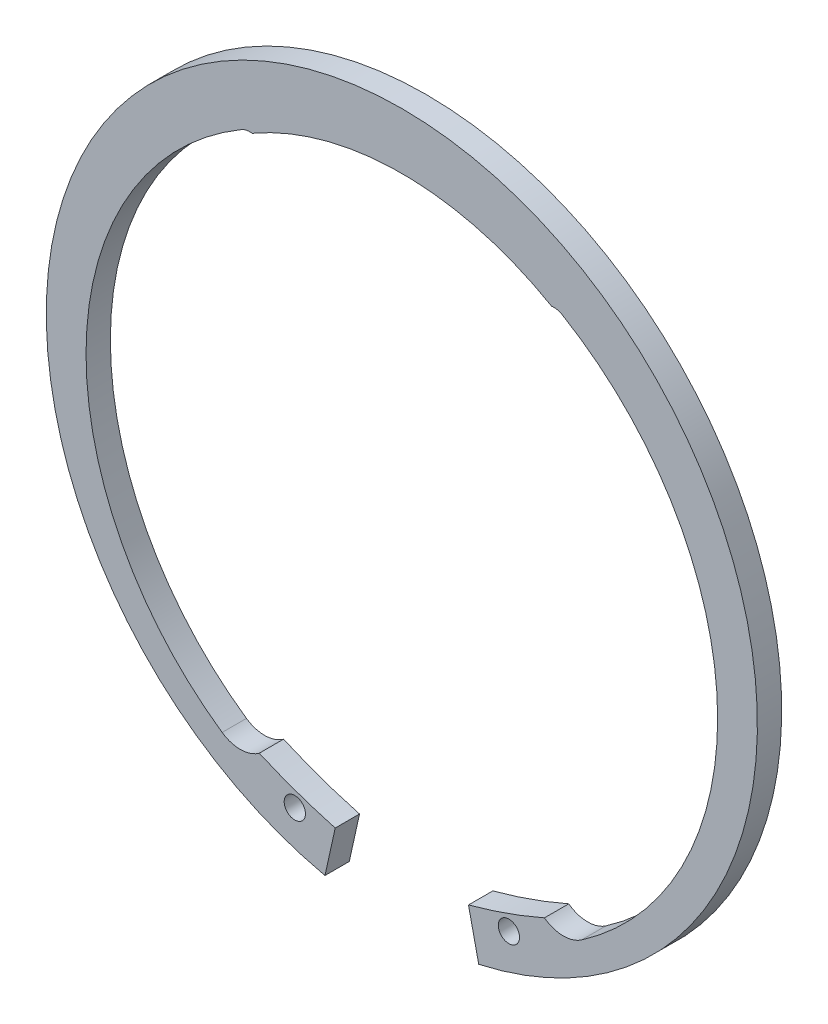
ISO-10303-21;
HEADER;
FILE_DESCRIPTION(('STEP AP214'),'2;1');
FILE_NAME('part.step','',(''),(''),'','','');
FILE_SCHEMA(('AUTOMOTIVE_DESIGN { 1 0 10303 214 1 1 1 1 }'));
ENDSEC;
DATA;
#1=APPLICATION_CONTEXT('core data for automotive mechanical design processes');
#2=APPLICATION_PROTOCOL_DEFINITION('international standard','automotive_design',2000,#1);
#3=PRODUCT_CONTEXT('',#1,'mechanical');
#4=PRODUCT('Part','Part','',(#3));
#5=PRODUCT_RELATED_PRODUCT_CATEGORY('part','',(#4));
#6=PRODUCT_DEFINITION_FORMATION('','',#4);
#7=PRODUCT_DEFINITION_CONTEXT('part definition',#1,'design');
#8=PRODUCT_DEFINITION('design','',#6,#7);
#9=PRODUCT_DEFINITION_SHAPE('','',#8);
#10=(LENGTH_UNIT() NAMED_UNIT(*) SI_UNIT(.MILLI.,.METRE.));
#11=(NAMED_UNIT(*) PLANE_ANGLE_UNIT() SI_UNIT($,.RADIAN.));
#12=(NAMED_UNIT(*) SI_UNIT($,.STERADIAN.) SOLID_ANGLE_UNIT());
#13=UNCERTAINTY_MEASURE_WITH_UNIT(LENGTH_MEASURE(1.E-05),#10,'distance_accuracy_value','');
#14=(GEOMETRIC_REPRESENTATION_CONTEXT(3) GLOBAL_UNCERTAINTY_ASSIGNED_CONTEXT((#13)) GLOBAL_UNIT_ASSIGNED_CONTEXT((#10,
#11,#12)) REPRESENTATION_CONTEXT('',''));
#15=CARTESIAN_POINT('',(0.,0.,0.));
#16=DIRECTION('',(0.,0.,1.));
#17=DIRECTION('',(1.,0.,0.));
#18=AXIS2_PLACEMENT_3D('',#15,#16,#17);
#19=CARTESIAN_POINT('',(0.,0.,-2.));
#20=DIRECTION('',(0.,0.,-1.));
#21=DIRECTION('',(-1.,0.,0.));
#22=AXIS2_PLACEMENT_3D('',#19,#20,#21);
#23=PLANE('',#22);
#24=CARTESIAN_POINT('',(17.6115210050812,-49.9392111625646,-2.));
#25=DIRECTION('',(0.,0.,1.));
#26=DIRECTION('',(-1.,0.,0.));
#27=AXIS2_PLACEMENT_3D('',#24,#25,#26);
#28=CIRCLE('',#27,1.75);
#29=CARTESIAN_POINT('',(15.8615210050812,-49.9392111625646,-2.));
#30=VERTEX_POINT('',#29);
#31=EDGE_CURVE('E169',#30,#30,#28,.T.);
#32=ORIENTED_EDGE('',*,*,#31,.T.);
#33=EDGE_LOOP('',(#32));
#34=FACE_BOUND('',#33,.T.);
#35=CARTESIAN_POINT('',(-17.6115210050812,-49.9392111625646,-2.));
#36=DIRECTION('',(0.,0.,1.));
#37=DIRECTION('',(1.,0.,0.));
#38=AXIS2_PLACEMENT_3D('',#35,#36,#37);
#39=CIRCLE('',#38,1.75);
#40=CARTESIAN_POINT('',(-15.8615210050812,-49.9392111625646,-2.));
#41=VERTEX_POINT('',#40);
#42=EDGE_CURVE('E178',#41,#41,#39,.T.);
#43=ORIENTED_EDGE('',*,*,#42,.T.);
#44=EDGE_LOOP('',(#43));
#45=FACE_BOUND('',#44,.T.);
#46=DIRECTION('',(0.216216216216215,-0.976345506388565,0.));
#47=VECTOR('',#46,1.);
#48=CARTESIAN_POINT('',(12.6486486486487,-57.116212123731,-2.));
#49=LINE('',#48,#47);
#50=CARTESIAN_POINT('',(10.9621621621622,-49.5007171739002,-2.));
#51=VERTEX_POINT('',#50);
#52=CARTESIAN_POINT('',(12.6486486486487,-57.116212123731,-2.));
#53=VERTEX_POINT('',#52);
#54=EDGE_CURVE('E200',#51,#53,#49,.T.);
#55=ORIENTED_EDGE('',*,*,#54,.F.);
#56=CARTESIAN_POINT('',(-11.9615727865522,35.4286964420608,-2.));
#57=DIRECTION('',(0.,0.,-1.));
#58=DIRECTION('',(-1.,0.,0.));
#59=AXIS2_PLACEMENT_3D('',#56,#57,#58);
#60=CIRCLE('',#59,87.9687610527163);
#61=CARTESIAN_POINT('',(23.4623380808683,-45.0924154479705,-2.));
#62=VERTEX_POINT('',#61);
#63=EDGE_CURVE('E145',#62,#51,#60,.T.);
#64=ORIENTED_EDGE('',*,*,#63,.F.);
#65=CARTESIAN_POINT('',(26.5803005052665,-40.8685771082561,-2.));
#66=DIRECTION('',(0.,0.,-1.));
#67=DIRECTION('',(-1.,0.,0.));
#68=AXIS2_PLACEMENT_3D('',#65,#66,#67);
#69=CIRCLE('',#68,5.25);
#70=CARTESIAN_POINT('',(29.5678451103289,-45.1856452375265,-2.));
#71=VERTEX_POINT('',#70);
#72=EDGE_CURVE('E154',#71,#62,#69,.T.);
#73=ORIENTED_EDGE('',*,*,#72,.F.);
#74=CARTESIAN_POINT('',(0.,-2.45945411699753,-2.));
#75=DIRECTION('',(0.,0.,-1.));
#76=DIRECTION('',(-1.,0.,0.));
#77=AXIS2_PLACEMENT_3D('',#74,#75,#76);
#78=CIRCLE('',#77,51.9594541169975);
#79=CARTESIAN_POINT('',(26.420381097304,42.2814481404402,-2.));
#80=VERTEX_POINT('',#79);
#81=EDGE_CURVE('E193',#80,#71,#78,.T.);
#82=ORIENTED_EDGE('',*,*,#81,.F.);
#83=CARTESIAN_POINT('',(24.9821742273401,39.845954391957,-2.));
#84=DIRECTION('',(0.,0.,-1.));
#85=DIRECTION('',(-1.,0.,0.));
#86=AXIS2_PLACEMENT_3D('',#83,#84,#85);
#87=CIRCLE('',#86,2.82843928690575);
#88=CARTESIAN_POINT('',(24.6249999999997,42.6517511363838,-2.));
#89=VERTEX_POINT('',#88);
#90=EDGE_CURVE('E267',#89,#80,#87,.T.);
#91=ORIENTED_EDGE('',*,*,#90,.F.);
#92=CARTESIAN_POINT('',(0.,0.,-2.));
#93=DIRECTION('',(0.,0.,-1.));
#94=DIRECTION('',(-1.,0.,0.));
#95=AXIS2_PLACEMENT_3D('',#92,#93,#94);
#96=CIRCLE('',#95,49.25);
#97=CARTESIAN_POINT('',(-24.6249999999998,42.6517511363838,-2.));
#98=VERTEX_POINT('',#97);
#99=EDGE_CURVE('E296',#98,#89,#96,.T.);
#100=ORIENTED_EDGE('',*,*,#99,.F.);
#101=CARTESIAN_POINT('',(-24.9821742273401,39.845954391957,-2.));
#102=DIRECTION('',(0.,0.,-1.));
#103=DIRECTION('',(-1.,0.,0.));
#104=AXIS2_PLACEMENT_3D('',#101,#102,#103);
#105=CIRCLE('',#104,2.82843928690575);
#106=CARTESIAN_POINT('',(-26.420381097304,42.2814481404402,-2.));
#107=VERTEX_POINT('',#106);
#108=EDGE_CURVE('E260',#107,#98,#105,.T.);
#109=ORIENTED_EDGE('',*,*,#108,.F.);
#110=CARTESIAN_POINT('',(-29.5678451103289,-45.1856452375265,-2.));
#111=VERTEX_POINT('',#110);
#112=EDGE_CURVE('E194',#111,#107,#78,.T.);
#113=ORIENTED_EDGE('',*,*,#112,.F.);
#114=CARTESIAN_POINT('',(-26.5803005052665,-40.8685771082561,-2.));
#115=DIRECTION('',(0.,0.,-1.));
#116=DIRECTION('',(1.,0.,0.));
#117=AXIS2_PLACEMENT_3D('',#114,#115,#116);
#118=CIRCLE('',#117,5.25);
#119=CARTESIAN_POINT('',(-23.4623380808683,-45.0924154479705,-2.));
#120=VERTEX_POINT('',#119);
#121=EDGE_CURVE('E189',#120,#111,#118,.T.);
#122=ORIENTED_EDGE('',*,*,#121,.F.);
#123=CARTESIAN_POINT('',(11.9615727865522,35.4286964420608,-2.));
#124=DIRECTION('',(0.,0.,1.));
#125=DIRECTION('',(1.,0.,0.));
#126=AXIS2_PLACEMENT_3D('',#123,#124,#125);
#127=CIRCLE('',#126,87.9687610527163);
#128=CARTESIAN_POINT('',(-10.9621621621622,-49.5007171739002,-2.));
#129=VERTEX_POINT('',#128);
#130=EDGE_CURVE('E301',#120,#129,#127,.T.);
#131=ORIENTED_EDGE('',*,*,#130,.T.);
#132=DIRECTION('',(0.216216216216215,0.976345506388565,0.));
#133=VECTOR('',#132,1.);
#134=CARTESIAN_POINT('',(-12.6486486486486,-57.116212123731,-2.));
#135=LINE('',#134,#133);
#136=CARTESIAN_POINT('',(-12.6486486486486,-57.116212123731,-2.));
#137=VERTEX_POINT('',#136);
#138=EDGE_CURVE('E185',#137,#129,#135,.T.);
#139=ORIENTED_EDGE('',*,*,#138,.F.);
#140=CARTESIAN_POINT('',(0.,0.,-2.));
#141=DIRECTION('',(0.,0.,1.));
#142=DIRECTION('',(-1.,0.,0.));
#143=AXIS2_PLACEMENT_3D('',#140,#141,#142);
#144=CIRCLE('',#143,58.5);
#145=EDGE_CURVE('E182',#53,#137,#144,.T.);
#146=ORIENTED_EDGE('',*,*,#145,.F.);
#147=EDGE_LOOP('',(#55,#64,#73,#82,#91,#100,#109,#113,#122,#131,#139,#146));
#148=FACE_BOUND('',#147,.T.);
#149=ADVANCED_FACE('F43',(#34,#45,#148),#23,.T.);
#150=CARTESIAN_POINT('',(0.,0.,2.));
#151=DIRECTION('',(0.,0.,-1.));
#152=DIRECTION('',(-1.,0.,0.));
#153=AXIS2_PLACEMENT_3D('',#150,#151,#152);
#154=PLANE('',#153);
#155=CARTESIAN_POINT('',(17.6115210050812,-49.9392111625646,2.));
#156=DIRECTION('',(0.,0.,1.));
#157=DIRECTION('',(-1.,0.,0.));
#158=AXIS2_PLACEMENT_3D('',#155,#156,#157);
#159=CIRCLE('',#158,1.75);
#160=CARTESIAN_POINT('',(15.8615210050812,-49.9392111625646,2.));
#161=VERTEX_POINT('',#160);
#162=EDGE_CURVE('E237',#161,#161,#159,.T.);
#163=ORIENTED_EDGE('',*,*,#162,.F.);
#164=EDGE_LOOP('',(#163));
#165=FACE_BOUND('',#164,.T.);
#166=CARTESIAN_POINT('',(-17.6115210050812,-49.9392111625646,2.));
#167=DIRECTION('',(0.,0.,1.));
#168=DIRECTION('',(1.,0.,0.));
#169=AXIS2_PLACEMENT_3D('',#166,#167,#168);
#170=CIRCLE('',#169,1.75);
#171=CARTESIAN_POINT('',(-15.8615210050812,-49.9392111625646,2.));
#172=VERTEX_POINT('',#171);
#173=EDGE_CURVE('E232',#172,#172,#170,.T.);
#174=ORIENTED_EDGE('',*,*,#173,.F.);
#175=EDGE_LOOP('',(#174));
#176=FACE_BOUND('',#175,.T.);
#177=CARTESIAN_POINT('',(-11.9615727865522,35.4286964420608,2.));
#178=DIRECTION('',(0.,0.,-1.));
#179=DIRECTION('',(-1.,0.,0.));
#180=AXIS2_PLACEMENT_3D('',#177,#178,#179);
#181=CIRCLE('',#180,87.9687610527163);
#182=CARTESIAN_POINT('',(23.4623380808683,-45.0924154479705,2.));
#183=VERTEX_POINT('',#182);
#184=CARTESIAN_POINT('',(10.9621621621622,-49.5007171739002,2.));
#185=VERTEX_POINT('',#184);
#186=EDGE_CURVE('E134',#183,#185,#181,.T.);
#187=ORIENTED_EDGE('',*,*,#186,.T.);
#188=DIRECTION('',(0.216216216216215,-0.976345506388565,0.));
#189=VECTOR('',#188,1.);
#190=CARTESIAN_POINT('',(12.6486486486487,-57.116212123731,2.));
#191=LINE('',#190,#189);
#192=CARTESIAN_POINT('',(12.6486486486487,-57.116212123731,2.));
#193=VERTEX_POINT('',#192);
#194=EDGE_CURVE('E163',#185,#193,#191,.T.);
#195=ORIENTED_EDGE('',*,*,#194,.T.);
#196=CARTESIAN_POINT('',(0.,0.,2.));
#197=DIRECTION('',(0.,0.,1.));
#198=DIRECTION('',(-1.,0.,0.));
#199=AXIS2_PLACEMENT_3D('',#196,#197,#198);
#200=CIRCLE('',#199,58.5);
#201=CARTESIAN_POINT('',(-12.6486486486486,-57.116212123731,2.));
#202=VERTEX_POINT('',#201);
#203=EDGE_CURVE('E223',#193,#202,#200,.T.);
#204=ORIENTED_EDGE('',*,*,#203,.T.);
#205=DIRECTION('',(0.216216216216215,0.976345506388565,0.));
#206=VECTOR('',#205,1.);
#207=CARTESIAN_POINT('',(-12.6486486486486,-57.116212123731,2.));
#208=LINE('',#207,#206);
#209=CARTESIAN_POINT('',(-10.9621621621622,-49.5007171739002,2.));
#210=VERTEX_POINT('',#209);
#211=EDGE_CURVE('E225',#202,#210,#208,.T.);
#212=ORIENTED_EDGE('',*,*,#211,.T.);
#213=CARTESIAN_POINT('',(11.9615727865522,35.4286964420608,2.));
#214=DIRECTION('',(0.,0.,1.));
#215=DIRECTION('',(1.,0.,0.));
#216=AXIS2_PLACEMENT_3D('',#213,#214,#215);
#217=CIRCLE('',#216,87.9687610527163);
#218=CARTESIAN_POINT('',(-23.4623380808683,-45.0924154479705,2.));
#219=VERTEX_POINT('',#218);
#220=EDGE_CURVE('E248',#219,#210,#217,.T.);
#221=ORIENTED_EDGE('',*,*,#220,.F.);
#222=CARTESIAN_POINT('',(-26.5803005052665,-40.8685771082561,2.));
#223=DIRECTION('',(0.,0.,-1.));
#224=DIRECTION('',(1.,0.,0.));
#225=AXIS2_PLACEMENT_3D('',#222,#223,#224);
#226=CIRCLE('',#225,5.25);
#227=CARTESIAN_POINT('',(-29.5678451103289,-45.1856452375265,2.));
#228=VERTEX_POINT('',#227);
#229=EDGE_CURVE('E229',#219,#228,#226,.T.);
#230=ORIENTED_EDGE('',*,*,#229,.T.);
#231=CARTESIAN_POINT('',(0.,-2.45945411699753,2.));
#232=DIRECTION('',(0.,0.,-1.));
#233=DIRECTION('',(-1.,0.,0.));
#234=AXIS2_PLACEMENT_3D('',#231,#232,#233);
#235=CIRCLE('',#234,51.9594541169975);
#236=CARTESIAN_POINT('',(-26.420381097304,42.2814481404402,1.99999999999999));
#237=VERTEX_POINT('',#236);
#238=EDGE_CURVE('E164',#228,#237,#235,.T.);
#239=ORIENTED_EDGE('',*,*,#238,.T.);
#240=CARTESIAN_POINT('',(-24.9821742273401,39.845954391957,1.99999999999999));
#241=DIRECTION('',(0.,0.,-1.));
#242=DIRECTION('',(-1.,0.,0.));
#243=AXIS2_PLACEMENT_3D('',#240,#241,#242);
#244=CIRCLE('',#243,2.82843928690575);
#245=CARTESIAN_POINT('',(-24.6249999999998,42.6517511363838,1.99999999999999));
#246=VERTEX_POINT('',#245);
#247=EDGE_CURVE('E270',#246,#237,#244,.F.);
#248=ORIENTED_EDGE('',*,*,#247,.F.);
#249=CARTESIAN_POINT('',(0.,0.,1.99999999999999));
#250=DIRECTION('',(0.,0.,-1.));
#251=DIRECTION('',(-1.,0.,0.));
#252=AXIS2_PLACEMENT_3D('',#249,#250,#251);
#253=CIRCLE('',#252,49.25);
#254=CARTESIAN_POINT('',(24.6249999999997,42.6517511363838,1.99999999999999));
#255=VERTEX_POINT('',#254);
#256=EDGE_CURVE('E284',#255,#246,#253,.F.);
#257=ORIENTED_EDGE('',*,*,#256,.F.);
#258=CARTESIAN_POINT('',(24.9821742273401,39.845954391957,1.99999999999999));
#259=DIRECTION('',(0.,0.,-1.));
#260=DIRECTION('',(-1.,0.,0.));
#261=AXIS2_PLACEMENT_3D('',#258,#259,#260);
#262=CIRCLE('',#261,2.82843928690575);
#263=CARTESIAN_POINT('',(26.4203810973039,42.2814481404402,1.99999999999999));
#264=VERTEX_POINT('',#263);
#265=EDGE_CURVE('E277',#264,#255,#262,.F.);
#266=ORIENTED_EDGE('',*,*,#265,.F.);
#267=CARTESIAN_POINT('',(29.5678451103289,-45.1856452375265,2.));
#268=VERTEX_POINT('',#267);
#269=EDGE_CURVE('E160',#264,#268,#235,.T.);
#270=ORIENTED_EDGE('',*,*,#269,.T.);
#271=CARTESIAN_POINT('',(26.5803005052665,-40.8685771082561,2.));
#272=DIRECTION('',(0.,0.,-1.));
#273=DIRECTION('',(-1.,0.,0.));
#274=AXIS2_PLACEMENT_3D('',#271,#272,#273);
#275=CIRCLE('',#274,5.25);
#276=EDGE_CURVE('E152',#268,#183,#275,.T.);
#277=ORIENTED_EDGE('',*,*,#276,.T.);
#278=EDGE_LOOP('',(#187,#195,#204,#212,#221,#230,#239,#248,#257,#266,#270,#277));
#279=FACE_BOUND('',#278,.T.);
#280=ADVANCED_FACE('F158',(#165,#176,#279),#154,.F.);
#281=CARTESIAN_POINT('',(0.,-2.45945411699753,-2.));
#282=DIRECTION('',(0.,0.,1.));
#283=DIRECTION('',(1.,0.,0.));
#284=AXIS2_PLACEMENT_3D('',#281,#282,#283);
#285=CYLINDRICAL_SURFACE('',#284,51.9594541169975);
#286=ORIENTED_EDGE('',*,*,#269,.F.);
#287=DIRECTION('',(0.,0.,-1.));
#288=VECTOR('',#287,1.);
#289=CARTESIAN_POINT('',(26.420381097304,42.2814481404402,55.3315445140703));
#290=LINE('',#289,#288);
#291=EDGE_CURVE('E61',#264,#80,#290,.T.);
#292=ORIENTED_EDGE('',*,*,#291,.T.);
#293=ORIENTED_EDGE('',*,*,#81,.T.);
#294=DIRECTION('',(0.,0.,1.));
#295=VECTOR('',#294,1.);
#296=CARTESIAN_POINT('',(29.5678451103289,-45.1856452375265,-2.));
#297=LINE('',#296,#295);
#298=EDGE_CURVE('E156',#71,#268,#297,.T.);
#299=ORIENTED_EDGE('',*,*,#298,.T.);
#300=EDGE_LOOP('',(#286,#292,#293,#299));
#301=FACE_BOUND('',#300,.T.);
#302=ADVANCED_FACE('F325',(#301),#285,.F.);
#303=CARTESIAN_POINT('',(0.,0.,-2.));
#304=DIRECTION('',(0.,0.,1.));
#305=DIRECTION('',(1.,0.,0.));
#306=AXIS2_PLACEMENT_3D('',#303,#304,#305);
#307=CYLINDRICAL_SURFACE('',#306,58.5);
#308=DIRECTION('',(0.,0.,1.));
#309=VECTOR('',#308,1.);
#310=CARTESIAN_POINT('',(-12.6486486486486,-57.116212123731,-2.));
#311=LINE('',#310,#309);
#312=EDGE_CURVE('E47',#137,#202,#311,.T.);
#313=ORIENTED_EDGE('',*,*,#312,.T.);
#314=ORIENTED_EDGE('',*,*,#203,.F.);
#315=DIRECTION('',(0.,0.,1.));
#316=VECTOR('',#315,1.);
#317=CARTESIAN_POINT('',(12.6486486486487,-57.116212123731,-2.));
#318=LINE('',#317,#316);
#319=EDGE_CURVE('E11',#53,#193,#318,.T.);
#320=ORIENTED_EDGE('',*,*,#319,.F.);
#321=ORIENTED_EDGE('',*,*,#145,.T.);
#322=EDGE_LOOP('',(#313,#314,#320,#321));
#323=FACE_BOUND('',#322,.T.);
#324=ADVANCED_FACE('F45',(#323),#307,.T.);
#325=CARTESIAN_POINT('',(12.6486486486487,-57.116212123731,-2.));
#326=DIRECTION('',(-0.976345506388565,-0.216216216216215,0.));
#327=DIRECTION('',(0.216216216216215,-0.976345506388565,0.));
#328=AXIS2_PLACEMENT_3D('',#325,#326,#327);
#329=PLANE('',#328);
#330=ORIENTED_EDGE('',*,*,#319,.T.);
#331=ORIENTED_EDGE('',*,*,#194,.F.);
#332=DIRECTION('',(0.,0.,1.));
#333=VECTOR('',#332,1.);
#334=CARTESIAN_POINT('',(10.9621621621622,-49.5007171739002,-2.));
#335=LINE('',#334,#333);
#336=EDGE_CURVE('E53',#51,#185,#335,.T.);
#337=ORIENTED_EDGE('',*,*,#336,.F.);
#338=ORIENTED_EDGE('',*,*,#54,.T.);
#339=EDGE_LOOP('',(#330,#331,#337,#338));
#340=FACE_BOUND('',#339,.T.);
#341=ADVANCED_FACE('F312',(#340),#329,.T.);
#342=CARTESIAN_POINT('',(26.5803005052665,-40.8685771082561,-2.));
#343=DIRECTION('',(0.,0.,1.));
#344=DIRECTION('',(1.,0.,0.));
#345=AXIS2_PLACEMENT_3D('',#342,#343,#344);
#346=CYLINDRICAL_SURFACE('',#345,5.25);
#347=DIRECTION('',(0.,0.,1.));
#348=VECTOR('',#347,1.);
#349=CARTESIAN_POINT('',(23.4623380808683,-45.0924154479705,-2.));
#350=LINE('',#349,#348);
#351=EDGE_CURVE('E137',#62,#183,#350,.T.);
#352=ORIENTED_EDGE('',*,*,#351,.T.);
#353=ORIENTED_EDGE('',*,*,#276,.F.);
#354=ORIENTED_EDGE('',*,*,#298,.F.);
#355=ORIENTED_EDGE('',*,*,#72,.T.);
#356=EDGE_LOOP('',(#352,#353,#354,#355));
#357=FACE_BOUND('',#356,.T.);
#358=ADVANCED_FACE('F150',(#357),#346,.F.);
#359=DIRECTION('',(0.,0.,-1.));
#360=VECTOR('',#359,1.);
#361=CARTESIAN_POINT('',(-26.420381097304,42.2814481404402,55.3315445140703));
#362=LINE('',#361,#360);
#363=EDGE_CURVE('E255',#237,#107,#362,.T.);
#364=ORIENTED_EDGE('',*,*,#363,.F.);
#365=ORIENTED_EDGE('',*,*,#238,.F.);
#366=DIRECTION('',(0.,0.,1.));
#367=VECTOR('',#366,1.);
#368=CARTESIAN_POINT('',(-29.5678451103289,-45.1856452375265,-2.));
#369=LINE('',#368,#367);
#370=EDGE_CURVE('E208',#111,#228,#369,.T.);
#371=ORIENTED_EDGE('',*,*,#370,.F.);
#372=ORIENTED_EDGE('',*,*,#112,.T.);
#373=EDGE_LOOP('',(#364,#365,#371,#372));
#374=FACE_BOUND('',#373,.T.);
#375=ADVANCED_FACE('F253',(#374),#285,.F.);
#376=CARTESIAN_POINT('',(-26.5803005052665,-40.8685771082561,-2.));
#377=DIRECTION('',(0.,0.,1.));
#378=DIRECTION('',(1.,0.,0.));
#379=AXIS2_PLACEMENT_3D('',#376,#377,#378);
#380=CYLINDRICAL_SURFACE('',#379,5.25);
#381=ORIENTED_EDGE('',*,*,#370,.T.);
#382=ORIENTED_EDGE('',*,*,#229,.F.);
#383=DIRECTION('',(0.,0.,1.));
#384=VECTOR('',#383,1.);
#385=CARTESIAN_POINT('',(-23.4623380808683,-45.0924154479705,-2.));
#386=LINE('',#385,#384);
#387=EDGE_CURVE('E211',#120,#219,#386,.T.);
#388=ORIENTED_EDGE('',*,*,#387,.F.);
#389=ORIENTED_EDGE('',*,*,#121,.T.);
#390=EDGE_LOOP('',(#381,#382,#388,#389));
#391=FACE_BOUND('',#390,.T.);
#392=ADVANCED_FACE('F316',(#391),#380,.F.);
#393=CARTESIAN_POINT('',(-12.6486486486486,-57.116212123731,-2.));
#394=DIRECTION('',(0.976345506388565,-0.216216216216215,0.));
#395=DIRECTION('',(0.216216216216215,0.976345506388565,0.));
#396=AXIS2_PLACEMENT_3D('',#393,#394,#395);
#397=PLANE('',#396);
#398=DIRECTION('',(0.,0.,1.));
#399=VECTOR('',#398,1.);
#400=CARTESIAN_POINT('',(-10.9621621621622,-49.5007171739002,-2.));
#401=LINE('',#400,#399);
#402=EDGE_CURVE('E213',#129,#210,#401,.T.);
#403=ORIENTED_EDGE('',*,*,#402,.T.);
#404=ORIENTED_EDGE('',*,*,#211,.F.);
#405=ORIENTED_EDGE('',*,*,#312,.F.);
#406=ORIENTED_EDGE('',*,*,#138,.T.);
#407=EDGE_LOOP('',(#403,#404,#405,#406));
#408=FACE_BOUND('',#407,.T.);
#409=ADVANCED_FACE('F226',(#408),#397,.T.);
#410=CARTESIAN_POINT('',(-17.6115210050812,-49.9392111625646,-2.));
#411=DIRECTION('',(0.,0.,1.));
#412=DIRECTION('',(1.,0.,0.));
#413=AXIS2_PLACEMENT_3D('',#410,#411,#412);
#414=CYLINDRICAL_SURFACE('',#413,1.75);
#415=ORIENTED_EDGE('',*,*,#42,.F.);
#416=EDGE_LOOP('',(#415));
#417=FACE_BOUND('',#416,.T.);
#418=ORIENTED_EDGE('',*,*,#173,.T.);
#419=EDGE_LOOP('',(#418));
#420=FACE_BOUND('',#419,.T.);
#421=ADVANCED_FACE('F323',(#417,#420),#414,.F.);
#422=CARTESIAN_POINT('',(17.6115210050812,-49.9392111625646,-2.));
#423=DIRECTION('',(0.,0.,1.));
#424=DIRECTION('',(1.,0.,0.));
#425=AXIS2_PLACEMENT_3D('',#422,#423,#424);
#426=CYLINDRICAL_SURFACE('',#425,1.75);
#427=ORIENTED_EDGE('',*,*,#31,.F.);
#428=EDGE_LOOP('',(#427));
#429=FACE_BOUND('',#428,.T.);
#430=ORIENTED_EDGE('',*,*,#162,.T.);
#431=EDGE_LOOP('',(#430));
#432=FACE_BOUND('',#431,.T.);
#433=ADVANCED_FACE('F368',(#429,#432),#426,.F.);
#434=CARTESIAN_POINT('',(24.9821742273401,39.845954391957,55.3315445140703));
#435=DIRECTION('',(0.,0.,-1.));
#436=DIRECTION('',(-1.,0.,0.));
#437=AXIS2_PLACEMENT_3D('',#434,#435,#436);
#438=CYLINDRICAL_SURFACE('',#437,2.82843928690575);
#439=ORIENTED_EDGE('',*,*,#291,.F.);
#440=ORIENTED_EDGE('',*,*,#265,.T.);
#441=DIRECTION('',(0.,0.,-1.));
#442=VECTOR('',#441,1.);
#443=CARTESIAN_POINT('',(24.6249999999997,42.6517511363838,55.3315445140703));
#444=LINE('',#443,#442);
#445=EDGE_CURVE('E265',#255,#89,#444,.T.);
#446=ORIENTED_EDGE('',*,*,#445,.T.);
#447=ORIENTED_EDGE('',*,*,#90,.T.);
#448=EDGE_LOOP('',(#439,#440,#446,#447));
#449=FACE_BOUND('',#448,.T.);
#450=ADVANCED_FACE('F362',(#449),#438,.F.);
#451=CARTESIAN_POINT('',(0.,0.,55.3315445140703));
#452=DIRECTION('',(0.,0.,-1.));
#453=DIRECTION('',(-1.,0.,0.));
#454=AXIS2_PLACEMENT_3D('',#451,#452,#453);
#455=CYLINDRICAL_SURFACE('',#454,49.25);
#456=ORIENTED_EDGE('',*,*,#445,.F.);
#457=ORIENTED_EDGE('',*,*,#256,.T.);
#458=DIRECTION('',(0.,0.,-1.));
#459=VECTOR('',#458,1.);
#460=CARTESIAN_POINT('',(-24.6249999999998,42.6517511363838,55.3315445140703));
#461=LINE('',#460,#459);
#462=EDGE_CURVE('E275',#246,#98,#461,.T.);
#463=ORIENTED_EDGE('',*,*,#462,.T.);
#464=ORIENTED_EDGE('',*,*,#99,.T.);
#465=EDGE_LOOP('',(#456,#457,#463,#464));
#466=FACE_BOUND('',#465,.T.);
#467=ADVANCED_FACE('F367',(#466),#455,.F.);
#468=CARTESIAN_POINT('',(-24.9821742273401,39.845954391957,55.3315445140703));
#469=DIRECTION('',(0.,0.,-1.));
#470=DIRECTION('',(-1.,0.,0.));
#471=AXIS2_PLACEMENT_3D('',#468,#469,#470);
#472=CYLINDRICAL_SURFACE('',#471,2.82843928690575);
#473=ORIENTED_EDGE('',*,*,#462,.F.);
#474=ORIENTED_EDGE('',*,*,#247,.T.);
#475=ORIENTED_EDGE('',*,*,#363,.T.);
#476=ORIENTED_EDGE('',*,*,#108,.T.);
#477=EDGE_LOOP('',(#473,#474,#475,#476));
#478=FACE_BOUND('',#477,.T.);
#479=ADVANCED_FACE('F378',(#478),#472,.F.);
#480=CARTESIAN_POINT('',(11.9615727865522,35.4286964420608,-2.));
#481=DIRECTION('',(0.,0.,1.));
#482=DIRECTION('',(1.,0.,0.));
#483=AXIS2_PLACEMENT_3D('',#480,#481,#482);
#484=CYLINDRICAL_SURFACE('',#483,87.9687610527163);
#485=ORIENTED_EDGE('',*,*,#402,.F.);
#486=ORIENTED_EDGE('',*,*,#130,.F.);
#487=ORIENTED_EDGE('',*,*,#387,.T.);
#488=ORIENTED_EDGE('',*,*,#220,.T.);
#489=EDGE_LOOP('',(#485,#486,#487,#488));
#490=FACE_BOUND('',#489,.T.);
#491=ADVANCED_FACE('F315',(#490),#484,.F.);
#492=CARTESIAN_POINT('',(-11.9615727865522,35.4286964420608,-2.));
#493=DIRECTION('',(0.,0.,1.));
#494=DIRECTION('',(1.,0.,0.));
#495=AXIS2_PLACEMENT_3D('',#492,#493,#494);
#496=CYLINDRICAL_SURFACE('',#495,87.9687610527163);
#497=ORIENTED_EDGE('',*,*,#351,.F.);
#498=ORIENTED_EDGE('',*,*,#63,.T.);
#499=ORIENTED_EDGE('',*,*,#336,.T.);
#500=ORIENTED_EDGE('',*,*,#186,.F.);
#501=EDGE_LOOP('',(#497,#498,#499,#500));
#502=FACE_BOUND('',#501,.T.);
#503=ADVANCED_FACE('F136',(#502),#496,.F.);
#504=CLOSED_SHELL('',(#149,#280,#302,#324,#341,#358,#375,#392,#409,#421,#433,#450,#467,#479,
#491,#503));
#505=MANIFOLD_SOLID_BREP('B2',#504);
#506=ADVANCED_BREP_SHAPE_REPRESENTATION('',(#18,#505),#14);
#507=SHAPE_DEFINITION_REPRESENTATION(#9,#506);
ENDSEC;
END-ISO-10303-21;
